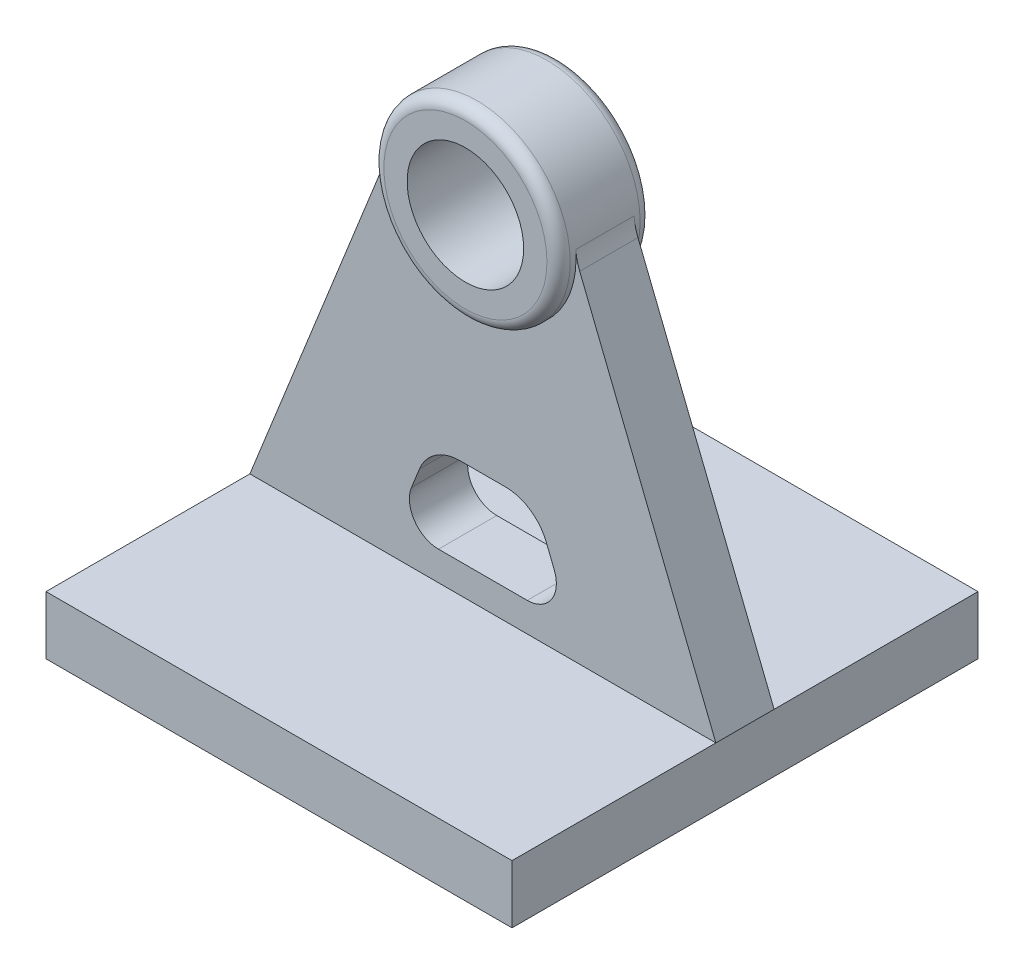
ISO-10303-21;
HEADER;
FILE_DESCRIPTION(('STEP AP214'),'2;1');
FILE_NAME('part.step','',(''),(''),'','','');
FILE_SCHEMA(('AUTOMOTIVE_DESIGN { 1 0 10303 214 1 1 1 1 }'));
ENDSEC;
DATA;
#1=APPLICATION_CONTEXT('core data for automotive mechanical design processes');
#2=APPLICATION_PROTOCOL_DEFINITION('international standard','automotive_design',2000,#1);
#3=PRODUCT_CONTEXT('',#1,'mechanical');
#4=PRODUCT('Part','Part','',(#3));
#5=PRODUCT_RELATED_PRODUCT_CATEGORY('part','',(#4));
#6=PRODUCT_DEFINITION_FORMATION('','',#4);
#7=PRODUCT_DEFINITION_CONTEXT('part definition',#1,'design');
#8=PRODUCT_DEFINITION('design','',#6,#7);
#9=PRODUCT_DEFINITION_SHAPE('','',#8);
#10=(LENGTH_UNIT() NAMED_UNIT(*) SI_UNIT(.MILLI.,.METRE.));
#11=(NAMED_UNIT(*) PLANE_ANGLE_UNIT() SI_UNIT($,.RADIAN.));
#12=(NAMED_UNIT(*) SI_UNIT($,.STERADIAN.) SOLID_ANGLE_UNIT());
#13=UNCERTAINTY_MEASURE_WITH_UNIT(LENGTH_MEASURE(1.E-05),#10,'distance_accuracy_value','');
#14=(GEOMETRIC_REPRESENTATION_CONTEXT(3) GLOBAL_UNCERTAINTY_ASSIGNED_CONTEXT((#13)) GLOBAL_UNIT_ASSIGNED_CONTEXT((#10,
#11,#12)) REPRESENTATION_CONTEXT('',''));
#15=CARTESIAN_POINT('',(0.,0.,0.));
#16=DIRECTION('',(0.,0.,1.));
#17=DIRECTION('',(1.,0.,0.));
#18=AXIS2_PLACEMENT_3D('',#15,#16,#17);
#19=CARTESIAN_POINT('',(0.,6.35,0.));
#20=DIRECTION('',(0.,-1.,0.));
#21=DIRECTION('',(0.,0.,-1.));
#22=AXIS2_PLACEMENT_3D('',#19,#20,#21);
#23=PLANE('',#22);
#24=DIRECTION('',(1.,0.,0.));
#25=VECTOR('',#24,1.);
#26=CARTESIAN_POINT('',(-25.4,6.35,3.175));
#27=LINE('',#26,#25);
#28=CARTESIAN_POINT('',(-25.4,6.35,3.175));
#29=VERTEX_POINT('',#28);
#30=CARTESIAN_POINT('',(25.4,6.35,3.175));
#31=VERTEX_POINT('',#30);
#32=EDGE_CURVE('E239',#29,#31,#27,.T.);
#33=ORIENTED_EDGE('',*,*,#32,.F.);
#34=DIRECTION('',(0.,0.,1.));
#35=VECTOR('',#34,1.);
#36=CARTESIAN_POINT('',(-25.4,6.35,25.4));
#37=LINE('',#36,#35);
#38=CARTESIAN_POINT('',(-25.4,6.35,25.4));
#39=VERTEX_POINT('',#38);
#40=EDGE_CURVE('E264',#29,#39,#37,.T.);
#41=ORIENTED_EDGE('',*,*,#40,.T.);
#42=DIRECTION('',(1.,0.,0.));
#43=VECTOR('',#42,1.);
#44=CARTESIAN_POINT('',(-25.4,6.35,25.4));
#45=LINE('',#44,#43);
#46=CARTESIAN_POINT('',(25.4,6.35,25.4));
#47=VERTEX_POINT('',#46);
#48=EDGE_CURVE('E268',#39,#47,#45,.T.);
#49=ORIENTED_EDGE('',*,*,#48,.T.);
#50=DIRECTION('',(0.,0.,-1.));
#51=VECTOR('',#50,1.);
#52=CARTESIAN_POINT('',(25.4,6.35,25.4));
#53=LINE('',#52,#51);
#54=EDGE_CURVE('E259',#47,#31,#53,.T.);
#55=ORIENTED_EDGE('',*,*,#54,.T.);
#56=EDGE_LOOP('',(#33,#41,#49,#55));
#57=FACE_BOUND('',#56,.T.);
#58=ADVANCED_FACE('F51',(#57),#23,.F.);
#59=CARTESIAN_POINT('',(25.4,6.35,25.4));
#60=DIRECTION('',(-1.,0.,0.));
#61=DIRECTION('',(0.,0.,1.));
#62=AXIS2_PLACEMENT_3D('',#59,#60,#61);
#63=PLANE('',#62);
#64=DIRECTION('',(0.,0.,-1.));
#65=VECTOR('',#64,1.);
#66=CARTESIAN_POINT('',(25.4,0.,25.4));
#67=LINE('',#66,#65);
#68=CARTESIAN_POINT('',(25.4,0.,25.4));
#69=VERTEX_POINT('',#68);
#70=CARTESIAN_POINT('',(25.4,0.,-25.4));
#71=VERTEX_POINT('',#70);
#72=EDGE_CURVE('E258',#69,#71,#67,.T.);
#73=ORIENTED_EDGE('',*,*,#72,.T.);
#74=DIRECTION('',(0.,-1.,0.));
#75=VECTOR('',#74,1.);
#76=CARTESIAN_POINT('',(25.4,6.35,-25.4));
#77=LINE('',#76,#75);
#78=CARTESIAN_POINT('',(25.4,6.35,-25.4));
#79=VERTEX_POINT('',#78);
#80=EDGE_CURVE('E287',#79,#71,#77,.T.);
#81=ORIENTED_EDGE('',*,*,#80,.F.);
#82=CARTESIAN_POINT('',(25.4,6.35,-3.175));
#83=VERTEX_POINT('',#82);
#84=EDGE_CURVE('E262',#83,#79,#53,.T.);
#85=ORIENTED_EDGE('',*,*,#84,.F.);
#86=DIRECTION('',(0.,0.,-1.));
#87=VECTOR('',#86,1.);
#88=CARTESIAN_POINT('',(25.4,6.35,3.175));
#89=LINE('',#88,#87);
#90=EDGE_CURVE('E245',#31,#83,#89,.T.);
#91=ORIENTED_EDGE('',*,*,#90,.F.);
#92=ORIENTED_EDGE('',*,*,#54,.F.);
#93=DIRECTION('',(0.,-1.,0.));
#94=VECTOR('',#93,1.);
#95=CARTESIAN_POINT('',(25.4,6.35,25.4));
#96=LINE('',#95,#94);
#97=EDGE_CURVE('E270',#47,#69,#96,.T.);
#98=ORIENTED_EDGE('',*,*,#97,.T.);
#99=EDGE_LOOP('',(#73,#81,#85,#91,#92,#98));
#100=FACE_BOUND('',#99,.T.);
#101=ADVANCED_FACE('F352',(#100),#63,.F.);
#102=CARTESIAN_POINT('',(-25.4,6.35,-25.4));
#103=DIRECTION('',(0.,0.,1.));
#104=DIRECTION('',(1.,0.,0.));
#105=AXIS2_PLACEMENT_3D('',#102,#103,#104);
#106=PLANE('',#105);
#107=DIRECTION('',(-1.,0.,0.));
#108=VECTOR('',#107,1.);
#109=CARTESIAN_POINT('',(-25.4,0.,-25.4));
#110=LINE('',#109,#108);
#111=CARTESIAN_POINT('',(-25.4,0.,-25.4));
#112=VERTEX_POINT('',#111);
#113=EDGE_CURVE('E273',#71,#112,#110,.T.);
#114=ORIENTED_EDGE('',*,*,#113,.T.);
#115=DIRECTION('',(0.,-1.,0.));
#116=VECTOR('',#115,1.);
#117=CARTESIAN_POINT('',(-25.4,6.35,-25.4));
#118=LINE('',#117,#116);
#119=CARTESIAN_POINT('',(-25.4,6.35,-25.4));
#120=VERTEX_POINT('',#119);
#121=EDGE_CURVE('E284',#120,#112,#118,.T.);
#122=ORIENTED_EDGE('',*,*,#121,.F.);
#123=DIRECTION('',(-1.,0.,0.));
#124=VECTOR('',#123,1.);
#125=CARTESIAN_POINT('',(-25.4,6.35,-25.4));
#126=LINE('',#125,#124);
#127=EDGE_CURVE('E261',#79,#120,#126,.T.);
#128=ORIENTED_EDGE('',*,*,#127,.F.);
#129=ORIENTED_EDGE('',*,*,#80,.T.);
#130=EDGE_LOOP('',(#114,#122,#128,#129));
#131=FACE_BOUND('',#130,.T.);
#132=ADVANCED_FACE('F355',(#131),#106,.F.);
#133=CARTESIAN_POINT('',(-25.4,6.35,25.4));
#134=DIRECTION('',(1.,0.,0.));
#135=DIRECTION('',(0.,0.,-1.));
#136=AXIS2_PLACEMENT_3D('',#133,#134,#135);
#137=PLANE('',#136);
#138=DIRECTION('',(0.,0.,1.));
#139=VECTOR('',#138,1.);
#140=CARTESIAN_POINT('',(-25.4,0.,25.4));
#141=LINE('',#140,#139);
#142=CARTESIAN_POINT('',(-25.4,0.,25.4));
#143=VERTEX_POINT('',#142);
#144=EDGE_CURVE('E275',#112,#143,#141,.T.);
#145=ORIENTED_EDGE('',*,*,#144,.T.);
#146=DIRECTION('',(0.,-1.,0.));
#147=VECTOR('',#146,1.);
#148=CARTESIAN_POINT('',(-25.4,6.35,25.4));
#149=LINE('',#148,#147);
#150=EDGE_CURVE('E281',#39,#143,#149,.T.);
#151=ORIENTED_EDGE('',*,*,#150,.F.);
#152=ORIENTED_EDGE('',*,*,#40,.F.);
#153=DIRECTION('',(0.,0.,-1.));
#154=VECTOR('',#153,1.);
#155=CARTESIAN_POINT('',(-25.4,6.35,3.175));
#156=LINE('',#155,#154);
#157=CARTESIAN_POINT('',(-25.4,6.35,-3.175));
#158=VERTEX_POINT('',#157);
#159=EDGE_CURVE('E255',#29,#158,#156,.T.);
#160=ORIENTED_EDGE('',*,*,#159,.T.);
#161=EDGE_CURVE('E265',#120,#158,#37,.T.);
#162=ORIENTED_EDGE('',*,*,#161,.F.);
#163=ORIENTED_EDGE('',*,*,#121,.T.);
#164=EDGE_LOOP('',(#145,#151,#152,#160,#162,#163));
#165=FACE_BOUND('',#164,.T.);
#166=ADVANCED_FACE('F338',(#165),#137,.F.);
#167=CARTESIAN_POINT('',(-25.4,6.35,25.4));
#168=DIRECTION('',(0.,0.,-1.));
#169=DIRECTION('',(-1.,0.,0.));
#170=AXIS2_PLACEMENT_3D('',#167,#168,#169);
#171=PLANE('',#170);
#172=DIRECTION('',(1.,0.,0.));
#173=VECTOR('',#172,1.);
#174=CARTESIAN_POINT('',(-25.4,0.,25.4));
#175=LINE('',#174,#173);
#176=EDGE_CURVE('E277',#143,#69,#175,.T.);
#177=ORIENTED_EDGE('',*,*,#176,.T.);
#178=ORIENTED_EDGE('',*,*,#97,.F.);
#179=ORIENTED_EDGE('',*,*,#48,.F.);
#180=ORIENTED_EDGE('',*,*,#150,.T.);
#181=EDGE_LOOP('',(#177,#178,#179,#180));
#182=FACE_BOUND('',#181,.T.);
#183=ADVANCED_FACE('F363',(#182),#171,.F.);
#184=ORIENTED_EDGE('',*,*,#161,.T.);
#185=DIRECTION('',(1.,0.,0.));
#186=VECTOR('',#185,1.);
#187=CARTESIAN_POINT('',(-25.4,6.35,-3.175));
#188=LINE('',#187,#186);
#189=EDGE_CURVE('E249',#158,#83,#188,.T.);
#190=ORIENTED_EDGE('',*,*,#189,.T.);
#191=ORIENTED_EDGE('',*,*,#84,.T.);
#192=ORIENTED_EDGE('',*,*,#127,.T.);
#193=EDGE_LOOP('',(#184,#190,#191,#192));
#194=FACE_BOUND('',#193,.T.);
#195=ADVANCED_FACE('F348',(#194),#23,.F.);
#196=CARTESIAN_POINT('',(0.,0.,0.));
#197=DIRECTION('',(0.,-1.,0.));
#198=DIRECTION('',(0.,0.,-1.));
#199=AXIS2_PLACEMENT_3D('',#196,#197,#198);
#200=PLANE('',#199);
#201=ORIENTED_EDGE('',*,*,#72,.F.);
#202=ORIENTED_EDGE('',*,*,#176,.F.);
#203=ORIENTED_EDGE('',*,*,#144,.F.);
#204=ORIENTED_EDGE('',*,*,#113,.F.);
#205=EDGE_LOOP('',(#201,#202,#203,#204));
#206=FACE_BOUND('',#205,.T.);
#207=ADVANCED_FACE('F360',(#206),#200,.T.);
#208=CARTESIAN_POINT('',(-10.16,44.45,3.175));
#209=DIRECTION('',(0.928476690885259,-0.371390676354104,0.));
#210=DIRECTION('',(0.371390676354104,0.928476690885259,0.));
#211=AXIS2_PLACEMENT_3D('',#208,#209,#210);
#212=PLANE('',#211);
#213=DIRECTION('',(-0.371390676354104,-0.928476690885259,0.));
#214=VECTOR('',#213,1.);
#215=CARTESIAN_POINT('',(-10.16,44.45,3.175));
#216=LINE('',#215,#214);
#217=CARTESIAN_POINT('',(-10.5577319420775,43.4556701448063,3.175));
#218=VERTEX_POINT('',#217);
#219=EDGE_CURVE('E236',#218,#29,#216,.T.);
#220=ORIENTED_EDGE('',*,*,#219,.F.);
#221=DIRECTION('',(0.,0.,1.));
#222=VECTOR('',#221,1.);
#223=CARTESIAN_POINT('',(-10.5577319420775,43.4556701448063,-3.175));
#224=LINE('',#223,#222);
#225=CARTESIAN_POINT('',(-10.5577319420775,43.4556701448063,-3.175));
#226=VERTEX_POINT('',#225);
#227=EDGE_CURVE('E302',#218,#226,#224,.F.);
#228=ORIENTED_EDGE('',*,*,#227,.T.);
#229=DIRECTION('',(-0.371390676354104,-0.928476690885259,0.));
#230=VECTOR('',#229,1.);
#231=CARTESIAN_POINT('',(-10.16,44.45,-3.175));
#232=LINE('',#231,#230);
#233=EDGE_CURVE('E247',#226,#158,#232,.T.);
#234=ORIENTED_EDGE('',*,*,#233,.T.);
#235=ORIENTED_EDGE('',*,*,#159,.F.);
#236=EDGE_LOOP('',(#220,#228,#234,#235));
#237=FACE_BOUND('',#236,.T.);
#238=ADVANCED_FACE('F342',(#237),#212,.F.);
#239=CARTESIAN_POINT('',(25.4,6.35,3.175));
#240=DIRECTION('',(-0.928476690885259,-0.371390676354103,0.));
#241=DIRECTION('',(0.371390676354104,-0.92847669088526,0.));
#242=AXIS2_PLACEMENT_3D('',#239,#240,#241);
#243=PLANE('',#242);
#244=DIRECTION('',(-0.371390676354103,0.928476690885259,0.));
#245=VECTOR('',#244,1.);
#246=CARTESIAN_POINT('',(25.4,6.35,-3.175));
#247=LINE('',#246,#245);
#248=CARTESIAN_POINT('',(10.5577319420775,43.4556701448062,-3.175));
#249=VERTEX_POINT('',#248);
#250=EDGE_CURVE('E237',#83,#249,#247,.T.);
#251=ORIENTED_EDGE('',*,*,#250,.T.);
#252=DIRECTION('',(0.,0.,1.));
#253=VECTOR('',#252,1.);
#254=CARTESIAN_POINT('',(10.5577319420775,43.4556701448062,3.175));
#255=LINE('',#254,#253);
#256=CARTESIAN_POINT('',(10.5577319420775,43.4556701448062,3.175));
#257=VERTEX_POINT('',#256);
#258=EDGE_CURVE('E311',#249,#257,#255,.T.);
#259=ORIENTED_EDGE('',*,*,#258,.T.);
#260=DIRECTION('',(-0.371390676354103,0.928476690885259,0.));
#261=VECTOR('',#260,1.);
#262=CARTESIAN_POINT('',(25.4,6.35,3.175));
#263=LINE('',#262,#261);
#264=EDGE_CURVE('E242',#31,#257,#263,.T.);
#265=ORIENTED_EDGE('',*,*,#264,.F.);
#266=ORIENTED_EDGE('',*,*,#90,.T.);
#267=EDGE_LOOP('',(#251,#259,#265,#266));
#268=FACE_BOUND('',#267,.T.);
#269=ADVANCED_FACE('F326',(#268),#243,.F.);
#270=CARTESIAN_POINT('',(0.,44.45,3.175));
#271=DIRECTION('',(0.,0.,1.));
#272=DIRECTION('',(1.,0.,0.));
#273=AXIS2_PLACEMENT_3D('',#270,#271,#272);
#274=PLANE('',#273);
#275=DIRECTION('',(-0.371390676354102,-0.92847669088526,0.));
#276=VECTOR('',#275,1.);
#277=CARTESIAN_POINT('',(-6.91250076154543,16.0562480961364,3.175));
#278=LINE('',#277,#276);
#279=CARTESIAN_POINT('',(-6.91250076154543,16.0562480961364,3.175));
#280=VERTEX_POINT('',#279);
#281=CARTESIAN_POINT('',(-7.78333384103028,13.8791653974243,3.175));
#282=VERTEX_POINT('',#281);
#283=EDGE_CURVE('E66',#280,#282,#278,.T.);
#284=ORIENTED_EDGE('',*,*,#283,.F.);
#285=CARTESIAN_POINT('',(-2.49063052120438,14.2875,3.175));
#286=DIRECTION('',(0.,0.,1.));
#287=DIRECTION('',(1.,0.,0.));
#288=AXIS2_PLACEMENT_3D('',#285,#286,#287);
#289=CIRCLE('',#288,4.7625);
#290=CARTESIAN_POINT('',(-2.49063052120438,19.05,3.175));
#291=VERTEX_POINT('',#290);
#292=EDGE_CURVE('E209',#291,#280,#289,.T.);
#293=ORIENTED_EDGE('',*,*,#292,.F.);
#294=DIRECTION('',(1.,0.,0.));
#295=VECTOR('',#294,1.);
#296=CARTESIAN_POINT('',(-2.49063052120438,19.05,3.175));
#297=LINE('',#296,#295);
#298=CARTESIAN_POINT('',(2.49063052120439,19.05,3.175));
#299=VERTEX_POINT('',#298);
#300=EDGE_CURVE('E206',#291,#299,#297,.T.);
#301=ORIENTED_EDGE('',*,*,#300,.T.);
#302=CARTESIAN_POINT('',(2.49063052120439,14.2875,3.175));
#303=DIRECTION('',(0.,0.,-1.));
#304=DIRECTION('',(-1.,0.,0.));
#305=AXIS2_PLACEMENT_3D('',#302,#303,#304);
#306=CIRCLE('',#305,4.7625);
#307=CARTESIAN_POINT('',(6.91250076154544,16.0562480961364,3.175));
#308=VERTEX_POINT('',#307);
#309=EDGE_CURVE('E203',#299,#308,#306,.T.);
#310=ORIENTED_EDGE('',*,*,#309,.T.);
#311=DIRECTION('',(0.371390676354102,-0.92847669088526,0.));
#312=VECTOR('',#311,1.);
#313=CARTESIAN_POINT('',(6.91250076154544,16.0562480961364,3.175));
#314=LINE('',#313,#312);
#315=CARTESIAN_POINT('',(7.78333384103029,13.8791653974243,3.175));
#316=VERTEX_POINT('',#315);
#317=EDGE_CURVE('E198',#308,#316,#314,.T.);
#318=ORIENTED_EDGE('',*,*,#317,.T.);
#319=CARTESIAN_POINT('',(4.83542034746959,12.7,3.175));
#320=DIRECTION('',(0.,0.,-1.));
#321=DIRECTION('',(-1.,0.,0.));
#322=AXIS2_PLACEMENT_3D('',#319,#320,#321);
#323=CIRCLE('',#322,3.175);
#324=CARTESIAN_POINT('',(4.83542034746959,9.525,3.175));
#325=VERTEX_POINT('',#324);
#326=EDGE_CURVE('E196',#316,#325,#323,.T.);
#327=ORIENTED_EDGE('',*,*,#326,.T.);
#328=DIRECTION('',(-1.,0.,0.));
#329=VECTOR('',#328,1.);
#330=CARTESIAN_POINT('',(4.83542034746959,9.525,3.175));
#331=LINE('',#330,#329);
#332=CARTESIAN_POINT('',(-4.83542034746959,9.525,3.175));
#333=VERTEX_POINT('',#332);
#334=EDGE_CURVE('E179',#325,#333,#331,.T.);
#335=ORIENTED_EDGE('',*,*,#334,.T.);
#336=CARTESIAN_POINT('',(-4.83542034746959,12.7,3.175));
#337=DIRECTION('',(0.,0.,1.));
#338=DIRECTION('',(1.,0.,0.));
#339=AXIS2_PLACEMENT_3D('',#336,#337,#338);
#340=CIRCLE('',#339,3.175);
#341=EDGE_CURVE('E188',#282,#333,#340,.T.);
#342=ORIENTED_EDGE('',*,*,#341,.F.);
#343=EDGE_LOOP('',(#284,#293,#301,#310,#318,#327,#335,#342));
#344=FACE_BOUND('',#343,.T.);
#345=CARTESIAN_POINT('',(0.,44.45,3.175));
#346=DIRECTION('',(0.,0.,-1.));
#347=DIRECTION('',(1.,0.,0.));
#348=AXIS2_PLACEMENT_3D('',#345,#346,#347);
#349=CIRCLE('',#348,10.16);
#350=CARTESIAN_POINT('',(10.1252670333532,45.2893851936337,3.175));
#351=VERTEX_POINT('',#350);
#352=CARTESIAN_POINT('',(-10.1252670333532,45.2893851936337,3.175));
#353=VERTEX_POINT('',#352);
#354=EDGE_CURVE('E234',#351,#353,#349,.T.);
#355=ORIENTED_EDGE('',*,*,#354,.T.);
#356=CARTESIAN_POINT('',(-16.4535589291989,45.8140009396548,3.175));
#357=DIRECTION('',(0.,0.,1.));
#358=DIRECTION('',(1.,0.,0.));
#359=AXIS2_PLACEMENT_3D('',#356,#357,#358);
#360=CIRCLE('',#359,6.35);
#361=EDGE_CURVE('E316',#353,#218,#360,.F.);
#362=ORIENTED_EDGE('',*,*,#361,.T.);
#363=ORIENTED_EDGE('',*,*,#219,.T.);
#364=ORIENTED_EDGE('',*,*,#32,.T.);
#365=ORIENTED_EDGE('',*,*,#264,.T.);
#366=CARTESIAN_POINT('',(16.4535589291989,45.8140009396548,3.175));
#367=DIRECTION('',(0.,0.,1.));
#368=DIRECTION('',(1.,0.,0.));
#369=AXIS2_PLACEMENT_3D('',#366,#367,#368);
#370=CIRCLE('',#369,6.35);
#371=EDGE_CURVE('E11',#257,#351,#370,.F.);
#372=ORIENTED_EDGE('',*,*,#371,.T.);
#373=EDGE_LOOP('',(#355,#362,#363,#364,#365,#372));
#374=FACE_BOUND('',#373,.T.);
#375=ADVANCED_FACE('F192',(#344,#374),#274,.T.);
#376=CARTESIAN_POINT('',(0.,44.45,-3.175));
#377=DIRECTION('',(0.,0.,1.));
#378=DIRECTION('',(1.,0.,0.));
#379=AXIS2_PLACEMENT_3D('',#376,#377,#378);
#380=PLANE('',#379);
#381=CARTESIAN_POINT('',(-2.49063052120438,14.2875,-3.175));
#382=DIRECTION('',(0.,0.,1.));
#383=DIRECTION('',(1.,0.,0.));
#384=AXIS2_PLACEMENT_3D('',#381,#382,#383);
#385=CIRCLE('',#384,4.7625);
#386=CARTESIAN_POINT('',(-6.91250076154543,16.0562480961364,-3.175));
#387=VERTEX_POINT('',#386);
#388=CARTESIAN_POINT('',(-2.49063052120438,19.05,-3.175));
#389=VERTEX_POINT('',#388);
#390=EDGE_CURVE('E444',#387,#389,#385,.F.);
#391=ORIENTED_EDGE('',*,*,#390,.F.);
#392=DIRECTION('',(0.371390676354102,0.92847669088526,0.));
#393=VECTOR('',#392,1.);
#394=CARTESIAN_POINT('',(-6.91250076154543,16.0562480961364,-3.175));
#395=LINE('',#394,#393);
#396=CARTESIAN_POINT('',(-7.78333384103028,13.8791653974243,-3.175));
#397=VERTEX_POINT('',#396);
#398=EDGE_CURVE('E227',#397,#387,#395,.T.);
#399=ORIENTED_EDGE('',*,*,#398,.F.);
#400=CARTESIAN_POINT('',(-4.83542034746959,12.7,-3.175));
#401=DIRECTION('',(0.,0.,1.));
#402=DIRECTION('',(1.,0.,0.));
#403=AXIS2_PLACEMENT_3D('',#400,#401,#402);
#404=CIRCLE('',#403,3.175);
#405=CARTESIAN_POINT('',(-4.83542034746959,9.525,-3.175));
#406=VERTEX_POINT('',#405);
#407=EDGE_CURVE('E224',#406,#397,#404,.F.);
#408=ORIENTED_EDGE('',*,*,#407,.F.);
#409=DIRECTION('',(1.,0.,0.));
#410=VECTOR('',#409,1.);
#411=CARTESIAN_POINT('',(4.83542034746959,9.525,-3.175));
#412=LINE('',#411,#410);
#413=CARTESIAN_POINT('',(4.83542034746959,9.525,-3.175));
#414=VERTEX_POINT('',#413);
#415=EDGE_CURVE('E182',#406,#414,#412,.T.);
#416=ORIENTED_EDGE('',*,*,#415,.T.);
#417=CARTESIAN_POINT('',(4.83542034746959,12.7,-3.175));
#418=DIRECTION('',(0.,0.,1.));
#419=DIRECTION('',(1.,0.,0.));
#420=AXIS2_PLACEMENT_3D('',#417,#418,#419);
#421=CIRCLE('',#420,3.175);
#422=CARTESIAN_POINT('',(7.78333384103029,13.8791653974243,-3.175));
#423=VERTEX_POINT('',#422);
#424=EDGE_CURVE('E462',#414,#423,#421,.T.);
#425=ORIENTED_EDGE('',*,*,#424,.T.);
#426=DIRECTION('',(-0.371390676354102,0.92847669088526,0.));
#427=VECTOR('',#426,1.);
#428=CARTESIAN_POINT('',(6.91250076154544,16.0562480961364,-3.175));
#429=LINE('',#428,#427);
#430=CARTESIAN_POINT('',(6.91250076154544,16.0562480961364,-3.175));
#431=VERTEX_POINT('',#430);
#432=EDGE_CURVE('E457',#423,#431,#429,.T.);
#433=ORIENTED_EDGE('',*,*,#432,.T.);
#434=CARTESIAN_POINT('',(2.49063052120439,14.2875,-3.175));
#435=DIRECTION('',(0.,0.,1.));
#436=DIRECTION('',(1.,0.,0.));
#437=AXIS2_PLACEMENT_3D('',#434,#435,#436);
#438=CIRCLE('',#437,4.7625);
#439=CARTESIAN_POINT('',(2.49063052120439,19.05,-3.175));
#440=VERTEX_POINT('',#439);
#441=EDGE_CURVE('E455',#431,#440,#438,.T.);
#442=ORIENTED_EDGE('',*,*,#441,.T.);
#443=DIRECTION('',(-1.,0.,0.));
#444=VECTOR('',#443,1.);
#445=CARTESIAN_POINT('',(-2.49063052120438,19.05,-3.175));
#446=LINE('',#445,#444);
#447=EDGE_CURVE('E449',#440,#389,#446,.T.);
#448=ORIENTED_EDGE('',*,*,#447,.T.);
#449=EDGE_LOOP('',(#391,#399,#408,#416,#425,#433,#442,#448));
#450=FACE_BOUND('',#449,.T.);
#451=CARTESIAN_POINT('',(0.,44.45,-3.175));
#452=DIRECTION('',(0.,0.,-1.));
#453=DIRECTION('',(1.,0.,0.));
#454=AXIS2_PLACEMENT_3D('',#451,#452,#453);
#455=CIRCLE('',#454,10.16);
#456=CARTESIAN_POINT('',(10.1252670333532,45.2893851936337,-3.175));
#457=VERTEX_POINT('',#456);
#458=CARTESIAN_POINT('',(-10.1252670333532,45.2893851936337,-3.175));
#459=VERTEX_POINT('',#458);
#460=EDGE_CURVE('E231',#457,#459,#455,.T.);
#461=ORIENTED_EDGE('',*,*,#460,.F.);
#462=CARTESIAN_POINT('',(16.4535589291989,45.8140009396548,-3.175));
#463=DIRECTION('',(0.,0.,1.));
#464=DIRECTION('',(1.,0.,0.));
#465=AXIS2_PLACEMENT_3D('',#462,#463,#464);
#466=CIRCLE('',#465,6.35);
#467=EDGE_CURVE('E59',#457,#249,#466,.T.);
#468=ORIENTED_EDGE('',*,*,#467,.T.);
#469=ORIENTED_EDGE('',*,*,#250,.F.);
#470=ORIENTED_EDGE('',*,*,#189,.F.);
#471=ORIENTED_EDGE('',*,*,#233,.F.);
#472=CARTESIAN_POINT('',(-16.4535589291989,45.8140009396548,-3.175));
#473=DIRECTION('',(0.,0.,1.));
#474=DIRECTION('',(1.,0.,0.));
#475=AXIS2_PLACEMENT_3D('',#472,#473,#474);
#476=CIRCLE('',#475,6.35);
#477=EDGE_CURVE('E313',#226,#459,#476,.T.);
#478=ORIENTED_EDGE('',*,*,#477,.T.);
#479=EDGE_LOOP('',(#461,#468,#469,#470,#471,#478));
#480=FACE_BOUND('',#479,.T.);
#481=ADVANCED_FACE('F320',(#450,#480),#380,.F.);
#482=CARTESIAN_POINT('',(0.,44.45,5.08));
#483=DIRECTION('',(0.,0.,1.));
#484=DIRECTION('',(1.,0.,0.));
#485=AXIS2_PLACEMENT_3D('',#482,#483,#484);
#486=PLANE('',#485);
#487=CARTESIAN_POINT('',(0.,44.45,5.08));
#488=DIRECTION('',(0.,0.,1.));
#489=DIRECTION('',(1.,0.,0.));
#490=AXIS2_PLACEMENT_3D('',#487,#488,#489);
#491=CIRCLE('',#490,8.89);
#492=CARTESIAN_POINT('',(8.89,44.45,5.08));
#493=VERTEX_POINT('',#492);
#494=EDGE_CURVE('E299',#493,#493,#491,.T.);
#495=ORIENTED_EDGE('',*,*,#494,.T.);
#496=EDGE_LOOP('',(#495));
#497=FACE_BOUND('',#496,.T.);
#498=CARTESIAN_POINT('',(0.,44.45,5.08));
#499=DIRECTION('',(0.,0.,1.));
#500=DIRECTION('',(1.,0.,0.));
#501=AXIS2_PLACEMENT_3D('',#498,#499,#500);
#502=CIRCLE('',#501,6.35);
#503=CARTESIAN_POINT('',(6.35,44.45,5.08));
#504=VERTEX_POINT('',#503);
#505=EDGE_CURVE('E228',#504,#504,#502,.T.);
#506=ORIENTED_EDGE('',*,*,#505,.F.);
#507=EDGE_LOOP('',(#506));
#508=FACE_BOUND('',#507,.T.);
#509=ADVANCED_FACE('F396',(#497,#508),#486,.T.);
#510=CARTESIAN_POINT('',(0.,44.45,-5.08));
#511=DIRECTION('',(0.,0.,1.));
#512=DIRECTION('',(1.,0.,0.));
#513=AXIS2_PLACEMENT_3D('',#510,#511,#512);
#514=PLANE('',#513);
#515=CARTESIAN_POINT('',(0.,44.45,-5.08));
#516=DIRECTION('',(0.,0.,1.));
#517=DIRECTION('',(1.,0.,0.));
#518=AXIS2_PLACEMENT_3D('',#515,#516,#517);
#519=CIRCLE('',#518,8.89);
#520=CARTESIAN_POINT('',(8.89,44.45,-5.08));
#521=VERTEX_POINT('',#520);
#522=EDGE_CURVE('E296',#521,#521,#519,.F.);
#523=ORIENTED_EDGE('',*,*,#522,.T.);
#524=EDGE_LOOP('',(#523));
#525=FACE_BOUND('',#524,.T.);
#526=CARTESIAN_POINT('',(0.,44.45,-5.08));
#527=DIRECTION('',(0.,0.,1.));
#528=DIRECTION('',(1.,0.,0.));
#529=AXIS2_PLACEMENT_3D('',#526,#527,#528);
#530=CIRCLE('',#529,6.35);
#531=CARTESIAN_POINT('',(6.35,44.45,-5.08));
#532=VERTEX_POINT('',#531);
#533=EDGE_CURVE('E226',#532,#532,#530,.T.);
#534=ORIENTED_EDGE('',*,*,#533,.T.);
#535=EDGE_LOOP('',(#534));
#536=FACE_BOUND('',#535,.T.);
#537=ADVANCED_FACE('F402',(#525,#536),#514,.F.);
#538=CARTESIAN_POINT('',(0.,44.45,5.08));
#539=DIRECTION('',(0.,0.,-1.));
#540=DIRECTION('',(-1.,0.,0.));
#541=AXIS2_PLACEMENT_3D('',#538,#539,#540);
#542=CYLINDRICAL_SURFACE('',#541,10.16);
#543=CARTESIAN_POINT('',(0.,44.45,-3.81));
#544=DIRECTION('',(0.,0.,1.));
#545=DIRECTION('',(1.,0.,0.));
#546=AXIS2_PLACEMENT_3D('',#543,#544,#545);
#547=CIRCLE('',#546,10.16);
#548=CARTESIAN_POINT('',(10.16,44.45,-3.81));
#549=VERTEX_POINT('',#548);
#550=EDGE_CURVE('E293',#549,#549,#547,.T.);
#551=ORIENTED_EDGE('',*,*,#550,.T.);
#552=EDGE_LOOP('',(#551));
#553=FACE_BOUND('',#552,.T.);
#554=CARTESIAN_POINT('',(0.,44.45,3.81));
#555=DIRECTION('',(0.,0.,1.));
#556=DIRECTION('',(1.,0.,0.));
#557=AXIS2_PLACEMENT_3D('',#554,#555,#556);
#558=CIRCLE('',#557,10.16);
#559=CARTESIAN_POINT('',(10.16,44.45,3.81));
#560=VERTEX_POINT('',#559);
#561=EDGE_CURVE('E290',#560,#560,#558,.F.);
#562=ORIENTED_EDGE('',*,*,#561,.T.);
#563=EDGE_LOOP('',(#562));
#564=FACE_BOUND('',#563,.T.);
#565=ORIENTED_EDGE('',*,*,#460,.T.);
#566=DIRECTION('',(0.,0.,-1.));
#567=VECTOR('',#566,1.);
#568=CARTESIAN_POINT('',(-10.1252670333532,45.2893851936337,5.08));
#569=LINE('',#568,#567);
#570=EDGE_CURVE('E308',#459,#353,#569,.F.);
#571=ORIENTED_EDGE('',*,*,#570,.T.);
#572=ORIENTED_EDGE('',*,*,#354,.F.);
#573=DIRECTION('',(0.,0.,-1.));
#574=VECTOR('',#573,1.);
#575=CARTESIAN_POINT('',(10.1252670333532,45.2893851936337,5.08));
#576=LINE('',#575,#574);
#577=EDGE_CURVE('E305',#351,#457,#576,.T.);
#578=ORIENTED_EDGE('',*,*,#577,.T.);
#579=EDGE_LOOP('',(#565,#571,#572,#578));
#580=FACE_BOUND('',#579,.T.);
#581=ADVANCED_FACE('F399',(#553,#564,#580),#542,.T.);
#582=CARTESIAN_POINT('',(0.,44.45,5.08));
#583=DIRECTION('',(0.,0.,-1.));
#584=DIRECTION('',(-1.,0.,0.));
#585=AXIS2_PLACEMENT_3D('',#582,#583,#584);
#586=CYLINDRICAL_SURFACE('',#585,6.35);
#587=ORIENTED_EDGE('',*,*,#505,.T.);
#588=EDGE_LOOP('',(#587));
#589=FACE_BOUND('',#588,.T.);
#590=ORIENTED_EDGE('',*,*,#533,.F.);
#591=EDGE_LOOP('',(#590));
#592=FACE_BOUND('',#591,.T.);
#593=ADVANCED_FACE('F401',(#589,#592),#586,.F.);
#594=CARTESIAN_POINT('',(0.,44.45,-3.81));
#595=DIRECTION('',(0.,0.,1.));
#596=DIRECTION('',(1.,0.,0.));
#597=AXIS2_PLACEMENT_3D('',#594,#595,#596);
#598=TOROIDAL_SURFACE('',#597,8.89,1.27);
#599=ORIENTED_EDGE('',*,*,#522,.F.);
#600=EDGE_LOOP('',(#599));
#601=FACE_BOUND('',#600,.T.);
#602=ORIENTED_EDGE('',*,*,#550,.F.);
#603=EDGE_LOOP('',(#602));
#604=FACE_BOUND('',#603,.T.);
#605=ADVANCED_FACE('F412',(#601,#604),#598,.T.);
#606=CARTESIAN_POINT('',(0.,44.45,3.81));
#607=DIRECTION('',(0.,0.,1.));
#608=DIRECTION('',(1.,0.,0.));
#609=AXIS2_PLACEMENT_3D('',#606,#607,#608);
#610=TOROIDAL_SURFACE('',#609,8.89,1.27);
#611=ORIENTED_EDGE('',*,*,#561,.F.);
#612=EDGE_LOOP('',(#611));
#613=FACE_BOUND('',#612,.T.);
#614=ORIENTED_EDGE('',*,*,#494,.F.);
#615=EDGE_LOOP('',(#614));
#616=FACE_BOUND('',#615,.T.);
#617=ADVANCED_FACE('F526',(#613,#616),#610,.T.);
#618=CARTESIAN_POINT('',(-16.4535589291989,45.8140009396548,5.08));
#619=DIRECTION('',(0.,0.,-1.));
#620=DIRECTION('',(-1.,0.,0.));
#621=AXIS2_PLACEMENT_3D('',#618,#619,#620);
#622=CYLINDRICAL_SURFACE('',#621,6.35);
#623=ORIENTED_EDGE('',*,*,#361,.F.);
#624=ORIENTED_EDGE('',*,*,#570,.F.);
#625=ORIENTED_EDGE('',*,*,#477,.F.);
#626=ORIENTED_EDGE('',*,*,#227,.F.);
#627=EDGE_LOOP('',(#623,#624,#625,#626));
#628=FACE_BOUND('',#627,.T.);
#629=ADVANCED_FACE('F520',(#628),#622,.F.);
#630=CARTESIAN_POINT('',(16.4535589291989,45.8140009396548,5.08));
#631=DIRECTION('',(0.,0.,-1.));
#632=DIRECTION('',(-1.,0.,0.));
#633=AXIS2_PLACEMENT_3D('',#630,#631,#632);
#634=CYLINDRICAL_SURFACE('',#633,6.35);
#635=ORIENTED_EDGE('',*,*,#371,.F.);
#636=ORIENTED_EDGE('',*,*,#258,.F.);
#637=ORIENTED_EDGE('',*,*,#467,.F.);
#638=ORIENTED_EDGE('',*,*,#577,.F.);
#639=EDGE_LOOP('',(#635,#636,#637,#638));
#640=FACE_BOUND('',#639,.T.);
#641=ADVANCED_FACE('F53',(#640),#634,.F.);
#642=CARTESIAN_POINT('',(-6.91250076154543,16.0562480961364,-21.8134806669594));
#643=DIRECTION('',(-0.92847669088526,0.371390676354102,0.));
#644=DIRECTION('',(-0.371390676354102,-0.92847669088526,0.));
#645=AXIS2_PLACEMENT_3D('',#642,#643,#644);
#646=PLANE('',#645);
#647=ORIENTED_EDGE('',*,*,#398,.T.);
#648=DIRECTION('',(0.,0.,1.));
#649=VECTOR('',#648,1.);
#650=CARTESIAN_POINT('',(-6.91250076154543,16.0562480961364,-21.8134806669594));
#651=LINE('',#650,#649);
#652=EDGE_CURVE('E212',#387,#280,#651,.T.);
#653=ORIENTED_EDGE('',*,*,#652,.T.);
#654=ORIENTED_EDGE('',*,*,#283,.T.);
#655=DIRECTION('',(0.,0.,1.));
#656=VECTOR('',#655,1.);
#657=CARTESIAN_POINT('',(-7.78333384103028,13.8791653974243,-21.8134806669594));
#658=LINE('',#657,#656);
#659=EDGE_CURVE('E185',#397,#282,#658,.T.);
#660=ORIENTED_EDGE('',*,*,#659,.F.);
#661=EDGE_LOOP('',(#647,#653,#654,#660));
#662=FACE_BOUND('',#661,.T.);
#663=ADVANCED_FACE('F414',(#662),#646,.F.);
#664=CARTESIAN_POINT('',(-2.49063052120438,14.2875,-21.8134806669594));
#665=DIRECTION('',(0.,0.,1.));
#666=DIRECTION('',(1.,0.,0.));
#667=AXIS2_PLACEMENT_3D('',#664,#665,#666);
#668=CYLINDRICAL_SURFACE('',#667,4.7625);
#669=ORIENTED_EDGE('',*,*,#390,.T.);
#670=DIRECTION('',(0.,0.,1.));
#671=VECTOR('',#670,1.);
#672=CARTESIAN_POINT('',(-2.49063052120438,19.05,-21.8134806669594));
#673=LINE('',#672,#671);
#674=EDGE_CURVE('E214',#389,#291,#673,.T.);
#675=ORIENTED_EDGE('',*,*,#674,.T.);
#676=ORIENTED_EDGE('',*,*,#292,.T.);
#677=ORIENTED_EDGE('',*,*,#652,.F.);
#678=EDGE_LOOP('',(#669,#675,#676,#677));
#679=FACE_BOUND('',#678,.T.);
#680=ADVANCED_FACE('F417',(#679),#668,.F.);
#681=CARTESIAN_POINT('',(-2.49063052120438,19.05,-21.8134806669594));
#682=DIRECTION('',(0.,-1.,0.));
#683=DIRECTION('',(0.,0.,-1.));
#684=AXIS2_PLACEMENT_3D('',#681,#682,#683);
#685=PLANE('',#684);
#686=DIRECTION('',(0.,0.,1.));
#687=VECTOR('',#686,1.);
#688=CARTESIAN_POINT('',(2.49063052120439,19.05,-21.8134806669594));
#689=LINE('',#688,#687);
#690=EDGE_CURVE('E216',#440,#299,#689,.T.);
#691=ORIENTED_EDGE('',*,*,#690,.T.);
#692=ORIENTED_EDGE('',*,*,#300,.F.);
#693=ORIENTED_EDGE('',*,*,#674,.F.);
#694=ORIENTED_EDGE('',*,*,#447,.F.);
#695=EDGE_LOOP('',(#691,#692,#693,#694));
#696=FACE_BOUND('',#695,.T.);
#697=ADVANCED_FACE('F433',(#696),#685,.T.);
#698=CARTESIAN_POINT('',(2.49063052120439,14.2875,-21.8134806669594));
#699=DIRECTION('',(0.,0.,1.));
#700=DIRECTION('',(1.,0.,0.));
#701=AXIS2_PLACEMENT_3D('',#698,#699,#700);
#702=CYLINDRICAL_SURFACE('',#701,4.7625);
#703=DIRECTION('',(0.,0.,1.));
#704=VECTOR('',#703,1.);
#705=CARTESIAN_POINT('',(6.91250076154544,16.0562480961364,-21.8134806669594));
#706=LINE('',#705,#704);
#707=EDGE_CURVE('E218',#431,#308,#706,.T.);
#708=ORIENTED_EDGE('',*,*,#707,.T.);
#709=ORIENTED_EDGE('',*,*,#309,.F.);
#710=ORIENTED_EDGE('',*,*,#690,.F.);
#711=ORIENTED_EDGE('',*,*,#441,.F.);
#712=EDGE_LOOP('',(#708,#709,#710,#711));
#713=FACE_BOUND('',#712,.T.);
#714=ADVANCED_FACE('F429',(#713),#702,.F.);
#715=CARTESIAN_POINT('',(6.91250076154544,16.0562480961364,-21.8134806669594));
#716=DIRECTION('',(-0.92847669088526,-0.371390676354102,0.));
#717=DIRECTION('',(0.371390676354102,-0.92847669088526,0.));
#718=AXIS2_PLACEMENT_3D('',#715,#716,#717);
#719=PLANE('',#718);
#720=DIRECTION('',(0.,0.,1.));
#721=VECTOR('',#720,1.);
#722=CARTESIAN_POINT('',(7.78333384103029,13.8791653974243,-21.8134806669594));
#723=LINE('',#722,#721);
#724=EDGE_CURVE('E220',#423,#316,#723,.T.);
#725=ORIENTED_EDGE('',*,*,#724,.T.);
#726=ORIENTED_EDGE('',*,*,#317,.F.);
#727=ORIENTED_EDGE('',*,*,#707,.F.);
#728=ORIENTED_EDGE('',*,*,#432,.F.);
#729=EDGE_LOOP('',(#725,#726,#727,#728));
#730=FACE_BOUND('',#729,.T.);
#731=ADVANCED_FACE('F425',(#730),#719,.T.);
#732=CARTESIAN_POINT('',(4.83542034746959,12.7,-21.8134806669594));
#733=DIRECTION('',(0.,0.,1.));
#734=DIRECTION('',(1.,0.,0.));
#735=AXIS2_PLACEMENT_3D('',#732,#733,#734);
#736=CYLINDRICAL_SURFACE('',#735,3.175);
#737=DIRECTION('',(0.,0.,1.));
#738=VECTOR('',#737,1.);
#739=CARTESIAN_POINT('',(4.83542034746959,9.525,-21.8134806669594));
#740=LINE('',#739,#738);
#741=EDGE_CURVE('E184',#414,#325,#740,.T.);
#742=ORIENTED_EDGE('',*,*,#741,.T.);
#743=ORIENTED_EDGE('',*,*,#326,.F.);
#744=ORIENTED_EDGE('',*,*,#724,.F.);
#745=ORIENTED_EDGE('',*,*,#424,.F.);
#746=EDGE_LOOP('',(#742,#743,#744,#745));
#747=FACE_BOUND('',#746,.T.);
#748=ADVANCED_FACE('F422',(#747),#736,.F.);
#749=CARTESIAN_POINT('',(4.83542034746959,9.525,-21.8134806669594));
#750=DIRECTION('',(0.,1.,0.));
#751=DIRECTION('',(-1.,0.,0.));
#752=AXIS2_PLACEMENT_3D('',#749,#750,#751);
#753=PLANE('',#752);
#754=DIRECTION('',(0.,0.,1.));
#755=VECTOR('',#754,1.);
#756=CARTESIAN_POINT('',(-4.83542034746959,9.525,-21.8134806669594));
#757=LINE('',#756,#755);
#758=EDGE_CURVE('E74',#406,#333,#757,.T.);
#759=ORIENTED_EDGE('',*,*,#758,.T.);
#760=ORIENTED_EDGE('',*,*,#334,.F.);
#761=ORIENTED_EDGE('',*,*,#741,.F.);
#762=ORIENTED_EDGE('',*,*,#415,.F.);
#763=EDGE_LOOP('',(#759,#760,#761,#762));
#764=FACE_BOUND('',#763,.T.);
#765=ADVANCED_FACE('F176',(#764),#753,.T.);
#766=CARTESIAN_POINT('',(-4.83542034746959,12.7,-21.8134806669594));
#767=DIRECTION('',(0.,0.,1.));
#768=DIRECTION('',(1.,0.,0.));
#769=AXIS2_PLACEMENT_3D('',#766,#767,#768);
#770=CYLINDRICAL_SURFACE('',#769,3.175);
#771=ORIENTED_EDGE('',*,*,#407,.T.);
#772=ORIENTED_EDGE('',*,*,#659,.T.);
#773=ORIENTED_EDGE('',*,*,#341,.T.);
#774=ORIENTED_EDGE('',*,*,#758,.F.);
#775=EDGE_LOOP('',(#771,#772,#773,#774));
#776=FACE_BOUND('',#775,.T.);
#777=ADVANCED_FACE('F189',(#776),#770,.F.);
#778=CLOSED_SHELL('',(#58,#101,#132,#166,#183,#195,#207,#238,#269,#375,#481,#509,#537,#581,#593,
#605,#617,#629,#641,#663,#680,#697,#714,#731,#748,#765,#777));
#779=MANIFOLD_SOLID_BREP('B2',#778);
#780=ADVANCED_BREP_SHAPE_REPRESENTATION('',(#18,#779),#14);
#781=SHAPE_DEFINITION_REPRESENTATION(#9,#780);
ENDSEC;
END-ISO-10303-21;
